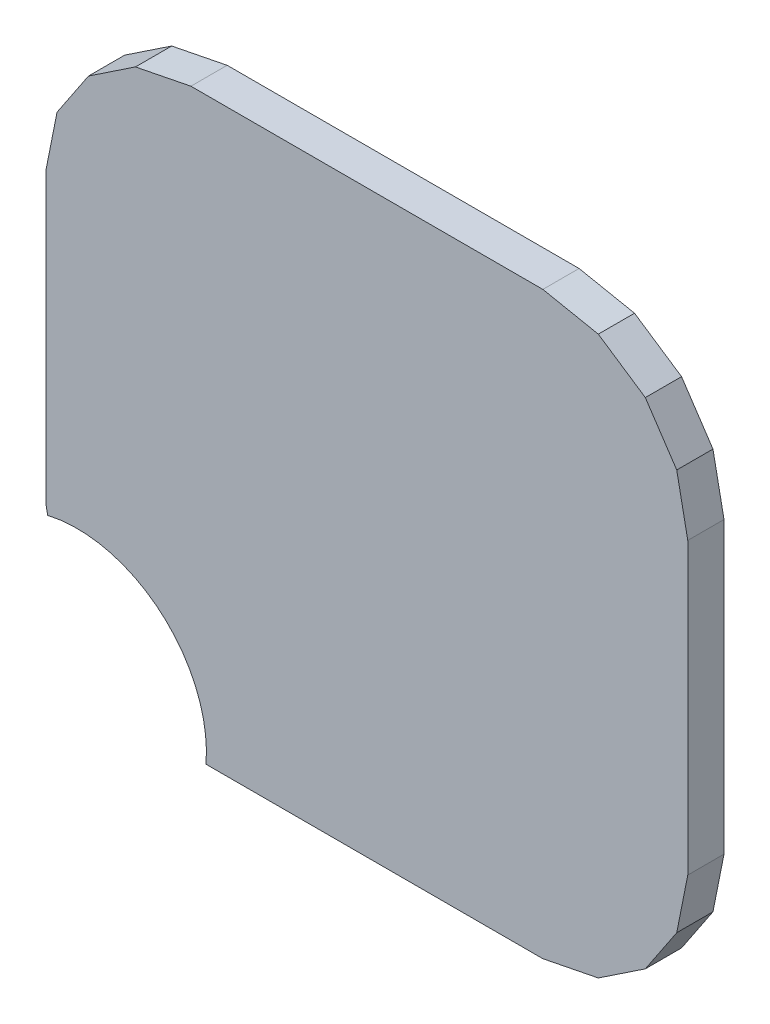
ISO-10303-21;
HEADER;
FILE_DESCRIPTION(('STEP AP214'),'2;1');
FILE_NAME('part.step','',(''),(''),'','','');
FILE_SCHEMA(('AUTOMOTIVE_DESIGN { 1 0 10303 214 1 1 1 1 }'));
ENDSEC;
DATA;
#1=APPLICATION_CONTEXT('core data for automotive mechanical design processes');
#2=APPLICATION_PROTOCOL_DEFINITION('international standard','automotive_design',2000,#1);
#3=PRODUCT_CONTEXT('',#1,'mechanical');
#4=PRODUCT('Part','Part','',(#3));
#5=PRODUCT_RELATED_PRODUCT_CATEGORY('part','',(#4));
#6=PRODUCT_DEFINITION_FORMATION('','',#4);
#7=PRODUCT_DEFINITION_CONTEXT('part definition',#1,'design');
#8=PRODUCT_DEFINITION('design','',#6,#7);
#9=PRODUCT_DEFINITION_SHAPE('','',#8);
#10=(LENGTH_UNIT() NAMED_UNIT(*) SI_UNIT(.MILLI.,.METRE.));
#11=(NAMED_UNIT(*) PLANE_ANGLE_UNIT() SI_UNIT($,.RADIAN.));
#12=(NAMED_UNIT(*) SI_UNIT($,.STERADIAN.) SOLID_ANGLE_UNIT());
#13=UNCERTAINTY_MEASURE_WITH_UNIT(LENGTH_MEASURE(1.E-05),#10,'distance_accuracy_value','');
#14=(GEOMETRIC_REPRESENTATION_CONTEXT(3) GLOBAL_UNCERTAINTY_ASSIGNED_CONTEXT((#13)) GLOBAL_UNIT_ASSIGNED_CONTEXT((#10,
#11,#12)) REPRESENTATION_CONTEXT('',''));
#15=CARTESIAN_POINT('',(0.,0.,0.));
#16=DIRECTION('',(0.,0.,1.));
#17=DIRECTION('',(1.,0.,0.));
#18=AXIS2_PLACEMENT_3D('',#15,#16,#17);
#19=CARTESIAN_POINT('',(147.64,-117.34,1.6));
#20=DIRECTION('',(1.,0.,0.));
#21=DIRECTION('',(0.,1.,0.));
#22=AXIS2_PLACEMENT_3D('',#19,#20,#21);
#23=PLANE('',#22);
#24=DIRECTION('',(0.,0.,1.));
#25=VECTOR('',#24,1.);
#26=CARTESIAN_POINT('',(147.64,-117.34,1.6));
#27=LINE('',#26,#25);
#28=CARTESIAN_POINT('',(147.64,-117.34,1.6));
#29=VERTEX_POINT('',#28);
#30=CARTESIAN_POINT('',(147.64,-117.34,1.635));
#31=VERTEX_POINT('',#30);
#32=EDGE_CURVE('E38',#29,#31,#27,.T.);
#33=ORIENTED_EDGE('',*,*,#32,.T.);
#34=DIRECTION('',(0.,-1.,0.));
#35=VECTOR('',#34,1.);
#36=CARTESIAN_POINT('',(147.64,-117.34,1.635));
#37=LINE('',#36,#35);
#38=CARTESIAN_POINT('',(147.64,-117.62,1.635));
#39=VERTEX_POINT('',#38);
#40=EDGE_CURVE('E326',#31,#39,#37,.T.);
#41=ORIENTED_EDGE('',*,*,#40,.T.);
#42=DIRECTION('',(0.,0.,1.));
#43=VECTOR('',#42,1.);
#44=CARTESIAN_POINT('',(147.64,-117.62,1.6));
#45=LINE('',#44,#43);
#46=CARTESIAN_POINT('',(147.64,-117.62,1.6));
#47=VERTEX_POINT('',#46);
#48=EDGE_CURVE('E11',#47,#39,#45,.T.);
#49=ORIENTED_EDGE('',*,*,#48,.F.);
#50=DIRECTION('',(0.,-1.,0.));
#51=VECTOR('',#50,1.);
#52=CARTESIAN_POINT('',(147.64,-117.34,1.6));
#53=LINE('',#52,#51);
#54=EDGE_CURVE('E223',#29,#47,#53,.T.);
#55=ORIENTED_EDGE('',*,*,#54,.F.);
#56=EDGE_LOOP('',(#33,#41,#49,#55));
#57=FACE_BOUND('',#56,.T.);
#58=ADVANCED_FACE('F17',(#57),#23,.T.);
#59=CARTESIAN_POINT('',(147.64,-117.62,1.6));
#60=DIRECTION('',(0.980785031686367,-0.195091572396073,0.));
#61=DIRECTION('',(0.,0.,-1.));
#62=AXIS2_PLACEMENT_3D('',#59,#60,#61);
#63=PLANE('',#62);
#64=ORIENTED_EDGE('',*,*,#48,.T.);
#65=DIRECTION('',(-0.195091572396073,-0.980785031686367,0.));
#66=VECTOR('',#65,1.);
#67=CARTESIAN_POINT('',(147.64,-117.62,1.635));
#68=LINE('',#67,#66);
#69=CARTESIAN_POINT('',(147.629343,-117.673576,1.635));
#70=VERTEX_POINT('',#69);
#71=EDGE_CURVE('E323',#39,#70,#68,.T.);
#72=ORIENTED_EDGE('',*,*,#71,.T.);
#73=DIRECTION('',(0.,0.,1.));
#74=VECTOR('',#73,1.);
#75=CARTESIAN_POINT('',(147.629343,-117.673576,1.6));
#76=LINE('',#75,#74);
#77=CARTESIAN_POINT('',(147.629343,-117.673576,1.6));
#78=VERTEX_POINT('',#77);
#79=EDGE_CURVE('E20',#78,#70,#76,.T.);
#80=ORIENTED_EDGE('',*,*,#79,.F.);
#81=DIRECTION('',(-0.195091572396073,-0.980785031686367,0.));
#82=VECTOR('',#81,1.);
#83=CARTESIAN_POINT('',(147.64,-117.62,1.6));
#84=LINE('',#83,#82);
#85=EDGE_CURVE('E225',#47,#78,#84,.T.);
#86=ORIENTED_EDGE('',*,*,#85,.F.);
#87=EDGE_LOOP('',(#64,#72,#80,#86));
#88=FACE_BOUND('',#87,.T.);
#89=ADVANCED_FACE('F411',(#88),#63,.T.);
#90=CARTESIAN_POINT('',(147.629343,-117.673576,1.6));
#91=DIRECTION('',(0.831469659284406,-0.555570162706272,0.));
#92=DIRECTION('',(0.,0.,-1.));
#93=AXIS2_PLACEMENT_3D('',#90,#91,#92);
#94=PLANE('',#93);
#95=ORIENTED_EDGE('',*,*,#79,.T.);
#96=DIRECTION('',(-0.555570162706272,-0.831469659284406,0.));
#97=VECTOR('',#96,1.);
#98=CARTESIAN_POINT('',(147.629343,-117.673576,1.635));
#99=LINE('',#98,#97);
#100=CARTESIAN_POINT('',(147.598995,-117.718995,1.635));
#101=VERTEX_POINT('',#100);
#102=EDGE_CURVE('E322',#70,#101,#99,.T.);
#103=ORIENTED_EDGE('',*,*,#102,.T.);
#104=DIRECTION('',(0.,0.,1.));
#105=VECTOR('',#104,1.);
#106=CARTESIAN_POINT('',(147.598995,-117.718995,1.6));
#107=LINE('',#106,#105);
#108=CARTESIAN_POINT('',(147.598995,-117.718995,1.6));
#109=VERTEX_POINT('',#108);
#110=EDGE_CURVE('E358',#109,#101,#107,.T.);
#111=ORIENTED_EDGE('',*,*,#110,.F.);
#112=DIRECTION('',(-0.555570162706272,-0.831469659284406,0.));
#113=VECTOR('',#112,1.);
#114=CARTESIAN_POINT('',(147.629343,-117.673576,1.6));
#115=LINE('',#114,#113);
#116=EDGE_CURVE('E229',#78,#109,#115,.T.);
#117=ORIENTED_EDGE('',*,*,#116,.F.);
#118=EDGE_LOOP('',(#95,#103,#111,#117));
#119=FACE_BOUND('',#118,.T.);
#120=ADVANCED_FACE('F408',(#119),#94,.T.);
#121=CARTESIAN_POINT('',(147.598995,-117.718995,1.6));
#122=DIRECTION('',(0.555570162706272,-0.831469659284406,0.));
#123=DIRECTION('',(0.,0.,-1.));
#124=AXIS2_PLACEMENT_3D('',#121,#122,#123);
#125=PLANE('',#124);
#126=ORIENTED_EDGE('',*,*,#110,.T.);
#127=DIRECTION('',(-0.831469659284406,-0.555570162706272,0.));
#128=VECTOR('',#127,1.);
#129=CARTESIAN_POINT('',(147.598995,-117.718995,1.635));
#130=LINE('',#129,#128);
#131=CARTESIAN_POINT('',(147.553576,-117.749343,1.635));
#132=VERTEX_POINT('',#131);
#133=EDGE_CURVE('E318',#101,#132,#130,.T.);
#134=ORIENTED_EDGE('',*,*,#133,.T.);
#135=DIRECTION('',(0.,0.,1.));
#136=VECTOR('',#135,1.);
#137=CARTESIAN_POINT('',(147.553576,-117.749343,1.6));
#138=LINE('',#137,#136);
#139=CARTESIAN_POINT('',(147.553576,-117.749343,1.6));
#140=VERTEX_POINT('',#139);
#141=EDGE_CURVE('E361',#140,#132,#138,.T.);
#142=ORIENTED_EDGE('',*,*,#141,.F.);
#143=DIRECTION('',(-0.831469659284406,-0.555570162706272,0.));
#144=VECTOR('',#143,1.);
#145=CARTESIAN_POINT('',(147.598995,-117.718995,1.6));
#146=LINE('',#145,#144);
#147=EDGE_CURVE('E250',#109,#140,#146,.T.);
#148=ORIENTED_EDGE('',*,*,#147,.F.);
#149=EDGE_LOOP('',(#126,#134,#142,#148));
#150=FACE_BOUND('',#149,.T.);
#151=ADVANCED_FACE('F375',(#150),#125,.T.);
#152=CARTESIAN_POINT('',(147.553576,-117.749343,1.6));
#153=DIRECTION('',(0.195091572396073,-0.980785031686367,0.));
#154=DIRECTION('',(0.,0.,-1.));
#155=AXIS2_PLACEMENT_3D('',#152,#153,#154);
#156=PLANE('',#155);
#157=ORIENTED_EDGE('',*,*,#141,.T.);
#158=DIRECTION('',(-0.980785031686367,-0.195091572396073,0.));
#159=VECTOR('',#158,1.);
#160=CARTESIAN_POINT('',(147.553576,-117.749343,1.635));
#161=LINE('',#160,#159);
#162=CARTESIAN_POINT('',(147.5,-117.76,1.635));
#163=VERTEX_POINT('',#162);
#164=EDGE_CURVE('E313',#132,#163,#161,.T.);
#165=ORIENTED_EDGE('',*,*,#164,.T.);
#166=DIRECTION('',(0.,0.,1.));
#167=VECTOR('',#166,1.);
#168=CARTESIAN_POINT('',(147.5,-117.76,1.6));
#169=LINE('',#168,#167);
#170=CARTESIAN_POINT('',(147.5,-117.76,1.6));
#171=VERTEX_POINT('',#170);
#172=EDGE_CURVE('E357',#171,#163,#169,.T.);
#173=ORIENTED_EDGE('',*,*,#172,.F.);
#174=DIRECTION('',(-0.980785031686367,-0.195091572396073,0.));
#175=VECTOR('',#174,1.);
#176=CARTESIAN_POINT('',(147.553576,-117.749343,1.6));
#177=LINE('',#176,#175);
#178=EDGE_CURVE('E245',#140,#171,#177,.T.);
#179=ORIENTED_EDGE('',*,*,#178,.F.);
#180=EDGE_LOOP('',(#157,#165,#173,#179));
#181=FACE_BOUND('',#180,.T.);
#182=ADVANCED_FACE('F368',(#181),#156,.T.);
#183=CARTESIAN_POINT('',(147.5,-117.76,1.6));
#184=DIRECTION('',(0.,-1.,0.));
#185=DIRECTION('',(0.,0.,-1.));
#186=AXIS2_PLACEMENT_3D('',#183,#184,#185);
#187=PLANE('',#186);
#188=DIRECTION('',(-1.,0.,0.));
#189=VECTOR('',#188,1.);
#190=CARTESIAN_POINT('',(147.5,-117.76,1.6));
#191=LINE('',#190,#189);
#192=CARTESIAN_POINT('',(147.17459935792,-117.76,1.6));
#193=VERTEX_POINT('',#192);
#194=EDGE_CURVE('E249',#171,#193,#191,.T.);
#195=ORIENTED_EDGE('',*,*,#194,.F.);
#196=ORIENTED_EDGE('',*,*,#172,.T.);
#197=DIRECTION('',(-1.,0.,0.));
#198=VECTOR('',#197,1.);
#199=CARTESIAN_POINT('',(147.5,-117.76,1.635));
#200=LINE('',#199,#198);
#201=CARTESIAN_POINT('',(147.17459935792,-117.76,1.635));
#202=VERTEX_POINT('',#201);
#203=EDGE_CURVE('E310',#163,#202,#200,.T.);
#204=ORIENTED_EDGE('',*,*,#203,.T.);
#205=DIRECTION('',(0.,0.,-1.));
#206=VECTOR('',#205,1.);
#207=CARTESIAN_POINT('',(147.17459935794,-117.76,-0.045));
#208=LINE('',#207,#206);
#209=EDGE_CURVE('E354',#202,#193,#208,.T.);
#210=ORIENTED_EDGE('',*,*,#209,.T.);
#211=EDGE_LOOP('',(#195,#196,#204,#210));
#212=FACE_BOUND('',#211,.T.);
#213=ADVANCED_FACE('F382',(#212),#187,.T.);
#214=CARTESIAN_POINT('',(147.05,-117.75,-0.045));
#215=DIRECTION('',(0.,0.,-1.));
#216=DIRECTION('',(0.,-1.,0.));
#217=AXIS2_PLACEMENT_3D('',#214,#215,#216);
#218=CYLINDRICAL_SURFACE('',#217,0.125);
#219=ORIENTED_EDGE('',*,*,#209,.F.);
#220=CARTESIAN_POINT('',(147.05,-117.75,1.635));
#221=DIRECTION('',(0.,0.,-1.));
#222=DIRECTION('',(0.,-1.,0.));
#223=AXIS2_PLACEMENT_3D('',#220,#221,#222);
#224=CIRCLE('',#223,0.125);
#225=CARTESIAN_POINT('',(147.0216428284,-117.628259001,1.635));
#226=VERTEX_POINT('',#225);
#227=EDGE_CURVE('E306',#226,#202,#224,.T.);
#228=ORIENTED_EDGE('',*,*,#227,.F.);
#229=DIRECTION('',(0.,0.,-1.));
#230=VECTOR('',#229,1.);
#231=CARTESIAN_POINT('',(147.0216428284,-117.628259001,-0.045));
#232=LINE('',#231,#230);
#233=CARTESIAN_POINT('',(147.0216428284,-117.628259001,1.6));
#234=VERTEX_POINT('',#233);
#235=EDGE_CURVE('E351',#226,#234,#232,.T.);
#236=ORIENTED_EDGE('',*,*,#235,.T.);
#237=CARTESIAN_POINT('',(147.05,-117.75,1.6));
#238=DIRECTION('',(0.,0.,-1.));
#239=DIRECTION('',(0.,-1.,0.));
#240=AXIS2_PLACEMENT_3D('',#237,#238,#239);
#241=CIRCLE('',#240,0.125);
#242=EDGE_CURVE('E254',#234,#193,#241,.T.);
#243=ORIENTED_EDGE('',*,*,#242,.T.);
#244=EDGE_LOOP('',(#219,#228,#236,#243));
#245=FACE_BOUND('',#244,.T.);
#246=ADVANCED_FACE('F486',(#245),#218,.F.);
#247=CARTESIAN_POINT('',(147.030657,-117.673576,1.6));
#248=DIRECTION('',(-0.980785031686367,-0.195091572396073,0.));
#249=DIRECTION('',(-0.195091572396073,0.980785031686367,0.));
#250=AXIS2_PLACEMENT_3D('',#247,#248,#249);
#251=PLANE('',#250);
#252=DIRECTION('',(-0.195091572396073,0.980785031686367,0.));
#253=VECTOR('',#252,1.);
#254=CARTESIAN_POINT('',(147.030657,-117.673576,1.6));
#255=LINE('',#254,#253);
#256=CARTESIAN_POINT('',(147.02,-117.62,1.6));
#257=VERTEX_POINT('',#256);
#258=EDGE_CURVE('E258',#234,#257,#255,.T.);
#259=ORIENTED_EDGE('',*,*,#258,.F.);
#260=ORIENTED_EDGE('',*,*,#235,.F.);
#261=DIRECTION('',(-0.195091572396073,0.980785031686367,0.));
#262=VECTOR('',#261,1.);
#263=CARTESIAN_POINT('',(147.030657,-117.673576,1.635));
#264=LINE('',#263,#262);
#265=CARTESIAN_POINT('',(147.02,-117.62,1.635));
#266=VERTEX_POINT('',#265);
#267=EDGE_CURVE('E302',#226,#266,#264,.T.);
#268=ORIENTED_EDGE('',*,*,#267,.T.);
#269=DIRECTION('',(0.,0.,1.));
#270=VECTOR('',#269,1.);
#271=CARTESIAN_POINT('',(147.02,-117.62,1.6));
#272=LINE('',#271,#270);
#273=EDGE_CURVE('E335',#257,#266,#272,.T.);
#274=ORIENTED_EDGE('',*,*,#273,.F.);
#275=EDGE_LOOP('',(#259,#260,#268,#274));
#276=FACE_BOUND('',#275,.T.);
#277=ADVANCED_FACE('F484',(#276),#251,.T.);
#278=CARTESIAN_POINT('',(147.02,-117.62,1.6));
#279=DIRECTION('',(-1.,0.,0.));
#280=DIRECTION('',(0.,0.,1.));
#281=AXIS2_PLACEMENT_3D('',#278,#279,#280);
#282=PLANE('',#281);
#283=ORIENTED_EDGE('',*,*,#273,.T.);
#284=DIRECTION('',(0.,1.,0.));
#285=VECTOR('',#284,1.);
#286=CARTESIAN_POINT('',(147.02,-117.62,1.635));
#287=LINE('',#286,#285);
#288=CARTESIAN_POINT('',(147.02,-117.34,1.635));
#289=VERTEX_POINT('',#288);
#290=EDGE_CURVE('E298',#266,#289,#287,.T.);
#291=ORIENTED_EDGE('',*,*,#290,.T.);
#292=DIRECTION('',(0.,0.,1.));
#293=VECTOR('',#292,1.);
#294=CARTESIAN_POINT('',(147.02,-117.34,1.6));
#295=LINE('',#294,#293);
#296=CARTESIAN_POINT('',(147.02,-117.34,1.6));
#297=VERTEX_POINT('',#296);
#298=EDGE_CURVE('E332',#297,#289,#295,.T.);
#299=ORIENTED_EDGE('',*,*,#298,.F.);
#300=DIRECTION('',(0.,1.,0.));
#301=VECTOR('',#300,1.);
#302=CARTESIAN_POINT('',(147.02,-117.62,1.6));
#303=LINE('',#302,#301);
#304=EDGE_CURVE('E262',#257,#297,#303,.T.);
#305=ORIENTED_EDGE('',*,*,#304,.F.);
#306=EDGE_LOOP('',(#283,#291,#299,#305));
#307=FACE_BOUND('',#306,.T.);
#308=ADVANCED_FACE('F480',(#307),#282,.T.);
#309=CARTESIAN_POINT('',(147.02,-117.34,1.6));
#310=DIRECTION('',(-0.980785031686367,0.195091572396073,0.));
#311=DIRECTION('',(0.,0.,1.));
#312=AXIS2_PLACEMENT_3D('',#309,#310,#311);
#313=PLANE('',#312);
#314=ORIENTED_EDGE('',*,*,#298,.T.);
#315=DIRECTION('',(0.195091572396073,0.980785031686367,0.));
#316=VECTOR('',#315,1.);
#317=CARTESIAN_POINT('',(147.02,-117.34,1.635));
#318=LINE('',#317,#316);
#319=CARTESIAN_POINT('',(147.030657,-117.286424,1.635));
#320=VERTEX_POINT('',#319);
#321=EDGE_CURVE('E294',#289,#320,#318,.T.);
#322=ORIENTED_EDGE('',*,*,#321,.T.);
#323=DIRECTION('',(0.,0.,1.));
#324=VECTOR('',#323,1.);
#325=CARTESIAN_POINT('',(147.030657,-117.286424,1.6));
#326=LINE('',#325,#324);
#327=CARTESIAN_POINT('',(147.030657,-117.286424,1.6));
#328=VERTEX_POINT('',#327);
#329=EDGE_CURVE('E336',#328,#320,#326,.T.);
#330=ORIENTED_EDGE('',*,*,#329,.F.);
#331=DIRECTION('',(0.195091572396073,0.980785031686367,0.));
#332=VECTOR('',#331,1.);
#333=CARTESIAN_POINT('',(147.02,-117.34,1.6));
#334=LINE('',#333,#332);
#335=EDGE_CURVE('E266',#297,#328,#334,.T.);
#336=ORIENTED_EDGE('',*,*,#335,.F.);
#337=EDGE_LOOP('',(#314,#322,#330,#336));
#338=FACE_BOUND('',#337,.T.);
#339=ADVANCED_FACE('F477',(#338),#313,.T.);
#340=CARTESIAN_POINT('',(147.030657,-117.286424,1.6));
#341=DIRECTION('',(-0.831469659284406,0.555570162706272,0.));
#342=DIRECTION('',(0.,0.,1.));
#343=AXIS2_PLACEMENT_3D('',#340,#341,#342);
#344=PLANE('',#343);
#345=ORIENTED_EDGE('',*,*,#329,.T.);
#346=DIRECTION('',(0.555570162706272,0.831469659284406,0.));
#347=VECTOR('',#346,1.);
#348=CARTESIAN_POINT('',(147.030657,-117.286424,1.635));
#349=LINE('',#348,#347);
#350=CARTESIAN_POINT('',(147.061005,-117.241005,1.635));
#351=VERTEX_POINT('',#350);
#352=EDGE_CURVE('E290',#320,#351,#349,.T.);
#353=ORIENTED_EDGE('',*,*,#352,.T.);
#354=DIRECTION('',(0.,0.,1.));
#355=VECTOR('',#354,1.);
#356=CARTESIAN_POINT('',(147.061005,-117.241005,1.6));
#357=LINE('',#356,#355);
#358=CARTESIAN_POINT('',(147.061005,-117.241005,1.6));
#359=VERTEX_POINT('',#358);
#360=EDGE_CURVE('E344',#359,#351,#357,.T.);
#361=ORIENTED_EDGE('',*,*,#360,.F.);
#362=DIRECTION('',(0.555570162706272,0.831469659284406,0.));
#363=VECTOR('',#362,1.);
#364=CARTESIAN_POINT('',(147.030657,-117.286424,1.6));
#365=LINE('',#364,#363);
#366=EDGE_CURVE('E270',#328,#359,#365,.T.);
#367=ORIENTED_EDGE('',*,*,#366,.F.);
#368=EDGE_LOOP('',(#345,#353,#361,#367));
#369=FACE_BOUND('',#368,.T.);
#370=ADVANCED_FACE('F474',(#369),#344,.T.);
#371=CARTESIAN_POINT('',(147.061005,-117.241005,1.6));
#372=DIRECTION('',(-0.555570162706272,0.831469659284406,0.));
#373=DIRECTION('',(0.,0.,1.));
#374=AXIS2_PLACEMENT_3D('',#371,#372,#373);
#375=PLANE('',#374);
#376=ORIENTED_EDGE('',*,*,#360,.T.);
#377=DIRECTION('',(0.831469659284406,0.555570162706272,0.));
#378=VECTOR('',#377,1.);
#379=CARTESIAN_POINT('',(147.061005,-117.241005,1.635));
#380=LINE('',#379,#378);
#381=CARTESIAN_POINT('',(147.106424,-117.210657,1.635));
#382=VERTEX_POINT('',#381);
#383=EDGE_CURVE('E286',#351,#382,#380,.T.);
#384=ORIENTED_EDGE('',*,*,#383,.T.);
#385=DIRECTION('',(0.,0.,1.));
#386=VECTOR('',#385,1.);
#387=CARTESIAN_POINT('',(147.106424,-117.210657,1.6));
#388=LINE('',#387,#386);
#389=CARTESIAN_POINT('',(147.106424,-117.210657,1.6));
#390=VERTEX_POINT('',#389);
#391=EDGE_CURVE('E339',#390,#382,#388,.T.);
#392=ORIENTED_EDGE('',*,*,#391,.F.);
#393=DIRECTION('',(0.831469659284406,0.555570162706272,0.));
#394=VECTOR('',#393,1.);
#395=CARTESIAN_POINT('',(147.061005,-117.241005,1.6));
#396=LINE('',#395,#394);
#397=EDGE_CURVE('E274',#359,#390,#396,.T.);
#398=ORIENTED_EDGE('',*,*,#397,.F.);
#399=EDGE_LOOP('',(#376,#384,#392,#398));
#400=FACE_BOUND('',#399,.T.);
#401=ADVANCED_FACE('F471',(#400),#375,.T.);
#402=CARTESIAN_POINT('',(147.106424,-117.210657,1.6));
#403=DIRECTION('',(-0.195091572396073,0.980785031686367,0.));
#404=DIRECTION('',(0.,0.,1.));
#405=AXIS2_PLACEMENT_3D('',#402,#403,#404);
#406=PLANE('',#405);
#407=ORIENTED_EDGE('',*,*,#391,.T.);
#408=DIRECTION('',(0.980785031686367,0.195091572396073,0.));
#409=VECTOR('',#408,1.);
#410=CARTESIAN_POINT('',(147.106424,-117.210657,1.635));
#411=LINE('',#410,#409);
#412=CARTESIAN_POINT('',(147.16,-117.2,1.635));
#413=VERTEX_POINT('',#412);
#414=EDGE_CURVE('E195',#382,#413,#411,.T.);
#415=ORIENTED_EDGE('',*,*,#414,.T.);
#416=DIRECTION('',(0.,0.,1.));
#417=VECTOR('',#416,1.);
#418=CARTESIAN_POINT('',(147.16,-117.2,1.6));
#419=LINE('',#418,#417);
#420=CARTESIAN_POINT('',(147.16,-117.2,1.6));
#421=VERTEX_POINT('',#420);
#422=EDGE_CURVE('E190',#421,#413,#419,.T.);
#423=ORIENTED_EDGE('',*,*,#422,.F.);
#424=DIRECTION('',(0.980785031686367,0.195091572396073,0.));
#425=VECTOR('',#424,1.);
#426=CARTESIAN_POINT('',(147.106424,-117.210657,1.6));
#427=LINE('',#426,#425);
#428=EDGE_CURVE('E278',#390,#421,#427,.T.);
#429=ORIENTED_EDGE('',*,*,#428,.F.);
#430=EDGE_LOOP('',(#407,#415,#423,#429));
#431=FACE_BOUND('',#430,.T.);
#432=ADVANCED_FACE('F466',(#431),#406,.T.);
#433=CARTESIAN_POINT('',(147.629343,-117.286424,1.6));
#434=DIRECTION('',(0.980785031686367,0.195091572396073,0.));
#435=DIRECTION('',(0.,0.,-1.));
#436=AXIS2_PLACEMENT_3D('',#433,#434,#435);
#437=PLANE('',#436);
#438=DIRECTION('',(0.,0.,1.));
#439=VECTOR('',#438,1.);
#440=CARTESIAN_POINT('',(147.629343,-117.286424,1.6));
#441=LINE('',#440,#439);
#442=CARTESIAN_POINT('',(147.629343,-117.286424,1.6));
#443=VERTEX_POINT('',#442);
#444=CARTESIAN_POINT('',(147.629343,-117.286424,1.635));
#445=VERTEX_POINT('',#444);
#446=EDGE_CURVE('E238',#443,#445,#441,.T.);
#447=ORIENTED_EDGE('',*,*,#446,.T.);
#448=DIRECTION('',(0.195091572396073,-0.980785031686367,0.));
#449=VECTOR('',#448,1.);
#450=CARTESIAN_POINT('',(147.629343,-117.286424,1.635));
#451=LINE('',#450,#449);
#452=EDGE_CURVE('E329',#445,#31,#451,.T.);
#453=ORIENTED_EDGE('',*,*,#452,.T.);
#454=ORIENTED_EDGE('',*,*,#32,.F.);
#455=DIRECTION('',(0.195091572396073,-0.980785031686367,0.));
#456=VECTOR('',#455,1.);
#457=CARTESIAN_POINT('',(147.629343,-117.286424,1.6));
#458=LINE('',#457,#456);
#459=EDGE_CURVE('E237',#443,#29,#458,.T.);
#460=ORIENTED_EDGE('',*,*,#459,.F.);
#461=EDGE_LOOP('',(#447,#453,#454,#460));
#462=FACE_BOUND('',#461,.T.);
#463=ADVANCED_FACE('F520',(#462),#437,.T.);
#464=CARTESIAN_POINT('',(147.16,-117.2,1.6));
#465=DIRECTION('',(0.,1.,0.));
#466=DIRECTION('',(1.,0.,0.));
#467=AXIS2_PLACEMENT_3D('',#464,#465,#466);
#468=PLANE('',#467);
#469=ORIENTED_EDGE('',*,*,#422,.T.);
#470=DIRECTION('',(1.,0.,0.));
#471=VECTOR('',#470,1.);
#472=CARTESIAN_POINT('',(147.16,-117.2,1.635));
#473=LINE('',#472,#471);
#474=CARTESIAN_POINT('',(147.5,-117.2,1.635));
#475=VERTEX_POINT('',#474);
#476=EDGE_CURVE('E184',#413,#475,#473,.T.);
#477=ORIENTED_EDGE('',*,*,#476,.T.);
#478=DIRECTION('',(0.,0.,1.));
#479=VECTOR('',#478,1.);
#480=CARTESIAN_POINT('',(147.5,-117.2,1.6));
#481=LINE('',#480,#479);
#482=CARTESIAN_POINT('',(147.5,-117.2,1.6));
#483=VERTEX_POINT('',#482);
#484=EDGE_CURVE('E189',#483,#475,#481,.T.);
#485=ORIENTED_EDGE('',*,*,#484,.F.);
#486=DIRECTION('',(1.,0.,0.));
#487=VECTOR('',#486,1.);
#488=CARTESIAN_POINT('',(147.16,-117.2,1.6));
#489=LINE('',#488,#487);
#490=EDGE_CURVE('E196',#421,#483,#489,.T.);
#491=ORIENTED_EDGE('',*,*,#490,.F.);
#492=EDGE_LOOP('',(#469,#477,#485,#491));
#493=FACE_BOUND('',#492,.T.);
#494=ADVANCED_FACE('F186',(#493),#468,.T.);
#495=CARTESIAN_POINT('',(147.33,-117.48,1.635));
#496=DIRECTION('',(0.,0.,-1.));
#497=DIRECTION('',(0.,-1.,0.));
#498=AXIS2_PLACEMENT_3D('',#495,#496,#497);
#499=PLANE('',#498);
#500=ORIENTED_EDGE('',*,*,#476,.F.);
#501=ORIENTED_EDGE('',*,*,#414,.F.);
#502=ORIENTED_EDGE('',*,*,#383,.F.);
#503=ORIENTED_EDGE('',*,*,#352,.F.);
#504=ORIENTED_EDGE('',*,*,#321,.F.);
#505=ORIENTED_EDGE('',*,*,#290,.F.);
#506=ORIENTED_EDGE('',*,*,#267,.F.);
#507=ORIENTED_EDGE('',*,*,#227,.T.);
#508=ORIENTED_EDGE('',*,*,#203,.F.);
#509=ORIENTED_EDGE('',*,*,#164,.F.);
#510=ORIENTED_EDGE('',*,*,#133,.F.);
#511=ORIENTED_EDGE('',*,*,#102,.F.);
#512=ORIENTED_EDGE('',*,*,#71,.F.);
#513=ORIENTED_EDGE('',*,*,#40,.F.);
#514=ORIENTED_EDGE('',*,*,#452,.F.);
#515=DIRECTION('',(0.555570162706272,-0.831469659284406,0.));
#516=VECTOR('',#515,1.);
#517=CARTESIAN_POINT('',(147.598995,-117.241005,1.635));
#518=LINE('',#517,#516);
#519=CARTESIAN_POINT('',(147.598995,-117.241005,1.635));
#520=VERTEX_POINT('',#519);
#521=EDGE_CURVE('E232',#520,#445,#518,.T.);
#522=ORIENTED_EDGE('',*,*,#521,.F.);
#523=DIRECTION('',(0.831469659284406,-0.555570162706272,0.));
#524=VECTOR('',#523,1.);
#525=CARTESIAN_POINT('',(147.553576,-117.210657,1.635));
#526=LINE('',#525,#524);
#527=CARTESIAN_POINT('',(147.553576,-117.210657,1.635));
#528=VERTEX_POINT('',#527);
#529=EDGE_CURVE('E202',#528,#520,#526,.T.);
#530=ORIENTED_EDGE('',*,*,#529,.F.);
#531=DIRECTION('',(0.980785031686367,-0.195091572396073,0.));
#532=VECTOR('',#531,1.);
#533=CARTESIAN_POINT('',(147.5,-117.2,1.635));
#534=LINE('',#533,#532);
#535=EDGE_CURVE('E199',#475,#528,#534,.T.);
#536=ORIENTED_EDGE('',*,*,#535,.F.);
#537=EDGE_LOOP('',(#500,#501,#502,#503,#504,#505,#506,#507,#508,#509,#510,#511,#512,#513,#514,
#522,#530,#536));
#538=FACE_BOUND('',#537,.T.);
#539=ADVANCED_FACE('F200',(#538),#499,.F.);
#540=CARTESIAN_POINT('',(147.33,-117.48,1.6));
#541=DIRECTION('',(0.,0.,-1.));
#542=DIRECTION('',(0.,-1.,0.));
#543=AXIS2_PLACEMENT_3D('',#540,#541,#542);
#544=PLANE('',#543);
#545=DIRECTION('',(0.980785031686367,-0.195091572396073,0.));
#546=VECTOR('',#545,1.);
#547=CARTESIAN_POINT('',(147.5,-117.2,1.6));
#548=LINE('',#547,#546);
#549=CARTESIAN_POINT('',(147.553576,-117.210657,1.6));
#550=VERTEX_POINT('',#549);
#551=EDGE_CURVE('E207',#483,#550,#548,.T.);
#552=ORIENTED_EDGE('',*,*,#551,.T.);
#553=DIRECTION('',(0.831469659284406,-0.555570162706272,0.));
#554=VECTOR('',#553,1.);
#555=CARTESIAN_POINT('',(147.553576,-117.210657,1.6));
#556=LINE('',#555,#554);
#557=CARTESIAN_POINT('',(147.598995,-117.241005,1.6));
#558=VERTEX_POINT('',#557);
#559=EDGE_CURVE('E212',#550,#558,#556,.T.);
#560=ORIENTED_EDGE('',*,*,#559,.T.);
#561=DIRECTION('',(0.555570162706272,-0.831469659284406,0.));
#562=VECTOR('',#561,1.);
#563=CARTESIAN_POINT('',(147.598995,-117.241005,1.6));
#564=LINE('',#563,#562);
#565=EDGE_CURVE('E233',#558,#443,#564,.T.);
#566=ORIENTED_EDGE('',*,*,#565,.T.);
#567=ORIENTED_EDGE('',*,*,#459,.T.);
#568=ORIENTED_EDGE('',*,*,#54,.T.);
#569=ORIENTED_EDGE('',*,*,#85,.T.);
#570=ORIENTED_EDGE('',*,*,#116,.T.);
#571=ORIENTED_EDGE('',*,*,#147,.T.);
#572=ORIENTED_EDGE('',*,*,#178,.T.);
#573=ORIENTED_EDGE('',*,*,#194,.T.);
#574=ORIENTED_EDGE('',*,*,#242,.F.);
#575=ORIENTED_EDGE('',*,*,#258,.T.);
#576=ORIENTED_EDGE('',*,*,#304,.T.);
#577=ORIENTED_EDGE('',*,*,#335,.T.);
#578=ORIENTED_EDGE('',*,*,#366,.T.);
#579=ORIENTED_EDGE('',*,*,#397,.T.);
#580=ORIENTED_EDGE('',*,*,#428,.T.);
#581=ORIENTED_EDGE('',*,*,#490,.T.);
#582=EDGE_LOOP('',(#552,#560,#566,#567,#568,#569,#570,#571,#572,#573,#574,#575,#576,#577,#578,
#579,#580,#581));
#583=FACE_BOUND('',#582,.T.);
#584=ADVANCED_FACE('F385',(#583),#544,.T.);
#585=CARTESIAN_POINT('',(147.598995,-117.241005,1.6));
#586=DIRECTION('',(0.831469659284406,0.555570162706272,0.));
#587=DIRECTION('',(0.,0.,-1.));
#588=AXIS2_PLACEMENT_3D('',#585,#586,#587);
#589=PLANE('',#588);
#590=DIRECTION('',(0.,0.,1.));
#591=VECTOR('',#590,1.);
#592=CARTESIAN_POINT('',(147.598995,-117.241005,1.6));
#593=LINE('',#592,#591);
#594=EDGE_CURVE('E219',#558,#520,#593,.T.);
#595=ORIENTED_EDGE('',*,*,#594,.T.);
#596=ORIENTED_EDGE('',*,*,#521,.T.);
#597=ORIENTED_EDGE('',*,*,#446,.F.);
#598=ORIENTED_EDGE('',*,*,#565,.F.);
#599=EDGE_LOOP('',(#595,#596,#597,#598));
#600=FACE_BOUND('',#599,.T.);
#601=ADVANCED_FACE('F531',(#600),#589,.T.);
#602=CARTESIAN_POINT('',(147.5,-117.2,1.6));
#603=DIRECTION('',(0.195091572396073,0.980785031686367,0.));
#604=DIRECTION('',(0.,0.,-1.));
#605=AXIS2_PLACEMENT_3D('',#602,#603,#604);
#606=PLANE('',#605);
#607=ORIENTED_EDGE('',*,*,#484,.T.);
#608=ORIENTED_EDGE('',*,*,#535,.T.);
#609=DIRECTION('',(0.,0.,1.));
#610=VECTOR('',#609,1.);
#611=CARTESIAN_POINT('',(147.553576,-117.210657,1.6));
#612=LINE('',#611,#610);
#613=EDGE_CURVE('E396',#550,#528,#612,.T.);
#614=ORIENTED_EDGE('',*,*,#613,.F.);
#615=ORIENTED_EDGE('',*,*,#551,.F.);
#616=EDGE_LOOP('',(#607,#608,#614,#615));
#617=FACE_BOUND('',#616,.T.);
#618=ADVANCED_FACE('F210',(#617),#606,.T.);
#619=CARTESIAN_POINT('',(147.553576,-117.210657,1.6));
#620=DIRECTION('',(0.555570162706272,0.831469659284406,0.));
#621=DIRECTION('',(0.,0.,-1.));
#622=AXIS2_PLACEMENT_3D('',#619,#620,#621);
#623=PLANE('',#622);
#624=ORIENTED_EDGE('',*,*,#613,.T.);
#625=ORIENTED_EDGE('',*,*,#529,.T.);
#626=ORIENTED_EDGE('',*,*,#594,.F.);
#627=ORIENTED_EDGE('',*,*,#559,.F.);
#628=EDGE_LOOP('',(#624,#625,#626,#627));
#629=FACE_BOUND('',#628,.T.);
#630=ADVANCED_FACE('F460',(#629),#623,.T.);
#631=CLOSED_SHELL('',(#58,#89,#120,#151,#182,#213,#246,#277,#308,#339,#370,#401,#432,#463,#494,
#539,#584,#601,#618,#630));
#632=MANIFOLD_SOLID_BREP('B1',#631);
#633=ADVANCED_BREP_SHAPE_REPRESENTATION('',(#18,#632),#14);
#634=SHAPE_DEFINITION_REPRESENTATION(#9,#633);
ENDSEC;
END-ISO-10303-21;
